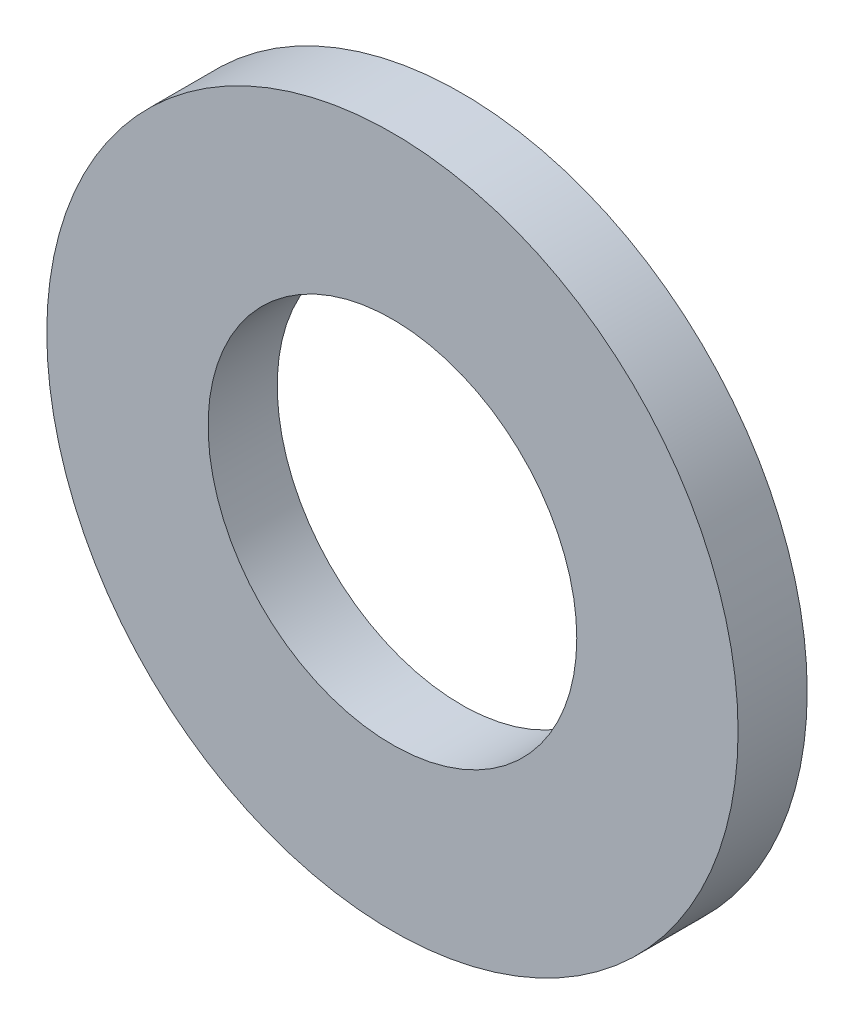
ISO-10303-21;
HEADER;
FILE_DESCRIPTION(('STEP AP214'),'2;1');
FILE_NAME('part.step','',(''),(''),'','','');
FILE_SCHEMA(('AUTOMOTIVE_DESIGN { 1 0 10303 214 1 1 1 1 }'));
ENDSEC;
DATA;
#1=APPLICATION_CONTEXT('core data for automotive mechanical design processes');
#2=APPLICATION_PROTOCOL_DEFINITION('international standard','automotive_design',2000,#1);
#3=PRODUCT_CONTEXT('',#1,'mechanical');
#4=PRODUCT('Part','Part','',(#3));
#5=PRODUCT_RELATED_PRODUCT_CATEGORY('part','',(#4));
#6=PRODUCT_DEFINITION_FORMATION('','',#4);
#7=PRODUCT_DEFINITION_CONTEXT('part definition',#1,'design');
#8=PRODUCT_DEFINITION('design','',#6,#7);
#9=PRODUCT_DEFINITION_SHAPE('','',#8);
#10=(LENGTH_UNIT() NAMED_UNIT(*) SI_UNIT(.MILLI.,.METRE.));
#11=(NAMED_UNIT(*) PLANE_ANGLE_UNIT() SI_UNIT($,.RADIAN.));
#12=(NAMED_UNIT(*) SI_UNIT($,.STERADIAN.) SOLID_ANGLE_UNIT());
#13=UNCERTAINTY_MEASURE_WITH_UNIT(LENGTH_MEASURE(1.E-05),#10,'distance_accuracy_value','');
#14=(GEOMETRIC_REPRESENTATION_CONTEXT(3) GLOBAL_UNCERTAINTY_ASSIGNED_CONTEXT((#13)) GLOBAL_UNIT_ASSIGNED_CONTEXT((#10,
#11,#12)) REPRESENTATION_CONTEXT('',''));
#15=CARTESIAN_POINT('',(0.,0.,0.));
#16=DIRECTION('',(0.,0.,1.));
#17=DIRECTION('',(1.,0.,0.));
#18=AXIS2_PLACEMENT_3D('',#15,#16,#17);
#19=CARTESIAN_POINT('',(0.,0.,0.6));
#20=DIRECTION('',(0.,0.,1.));
#21=DIRECTION('',(1.,0.,0.));
#22=AXIS2_PLACEMENT_3D('',#19,#20,#21);
#23=PLANE('',#22);
#24=CARTESIAN_POINT('',(0.,0.,0.6));
#25=DIRECTION('',(0.,0.,1.));
#26=DIRECTION('',(1.,0.,0.));
#27=AXIS2_PLACEMENT_3D('',#24,#25,#26);
#28=CIRCLE('',#27,3.);
#29=CARTESIAN_POINT('',(3.,0.,0.6));
#30=VERTEX_POINT('',#29);
#31=EDGE_CURVE('E10',#30,#30,#28,.T.);
#32=ORIENTED_EDGE('',*,*,#31,.T.);
#33=EDGE_LOOP('',(#32));
#34=FACE_BOUND('',#33,.T.);
#35=CARTESIAN_POINT('',(0.,0.,0.6));
#36=DIRECTION('',(0.,0.,1.));
#37=DIRECTION('',(1.,0.,0.));
#38=AXIS2_PLACEMENT_3D('',#35,#36,#37);
#39=CIRCLE('',#38,1.6);
#40=CARTESIAN_POINT('',(1.6,0.,0.6));
#41=VERTEX_POINT('',#40);
#42=EDGE_CURVE('E41',#41,#41,#39,.T.);
#43=ORIENTED_EDGE('',*,*,#42,.F.);
#44=EDGE_LOOP('',(#43));
#45=FACE_BOUND('',#44,.T.);
#46=ADVANCED_FACE('F30',(#34,#45),#23,.T.);
#47=CARTESIAN_POINT('',(0.,0.,0.));
#48=DIRECTION('',(0.,0.,1.));
#49=DIRECTION('',(1.,0.,0.));
#50=AXIS2_PLACEMENT_3D('',#47,#48,#49);
#51=PLANE('',#50);
#52=CARTESIAN_POINT('',(0.,0.,0.));
#53=DIRECTION('',(0.,0.,1.));
#54=DIRECTION('',(1.,0.,0.));
#55=AXIS2_PLACEMENT_3D('',#52,#53,#54);
#56=CIRCLE('',#55,3.);
#57=CARTESIAN_POINT('',(3.,0.,0.));
#58=VERTEX_POINT('',#57);
#59=EDGE_CURVE('E34',#58,#58,#56,.T.);
#60=ORIENTED_EDGE('',*,*,#59,.F.);
#61=EDGE_LOOP('',(#60));
#62=FACE_BOUND('',#61,.T.);
#63=CARTESIAN_POINT('',(0.,0.,0.));
#64=DIRECTION('',(0.,0.,1.));
#65=DIRECTION('',(1.,0.,0.));
#66=AXIS2_PLACEMENT_3D('',#63,#64,#65);
#67=CIRCLE('',#66,1.6);
#68=CARTESIAN_POINT('',(1.6,0.,0.));
#69=VERTEX_POINT('',#68);
#70=EDGE_CURVE('E43',#69,#69,#67,.T.);
#71=ORIENTED_EDGE('',*,*,#70,.T.);
#72=EDGE_LOOP('',(#71));
#73=FACE_BOUND('',#72,.T.);
#74=ADVANCED_FACE('F53',(#62,#73),#51,.F.);
#75=CARTESIAN_POINT('',(0.,0.,0.6));
#76=DIRECTION('',(0.,0.,-1.));
#77=DIRECTION('',(-1.,0.,0.));
#78=AXIS2_PLACEMENT_3D('',#75,#76,#77);
#79=CYLINDRICAL_SURFACE('',#78,3.);
#80=ORIENTED_EDGE('',*,*,#31,.F.);
#81=EDGE_LOOP('',(#80));
#82=FACE_BOUND('',#81,.T.);
#83=ORIENTED_EDGE('',*,*,#59,.T.);
#84=EDGE_LOOP('',(#83));
#85=FACE_BOUND('',#84,.T.);
#86=ADVANCED_FACE('F32',(#82,#85),#79,.T.);
#87=CARTESIAN_POINT('',(0.,0.,0.6));
#88=DIRECTION('',(0.,0.,-1.));
#89=DIRECTION('',(-1.,0.,0.));
#90=AXIS2_PLACEMENT_3D('',#87,#88,#89);
#91=CYLINDRICAL_SURFACE('',#90,1.6);
#92=ORIENTED_EDGE('',*,*,#42,.T.);
#93=EDGE_LOOP('',(#92));
#94=FACE_BOUND('',#93,.T.);
#95=ORIENTED_EDGE('',*,*,#70,.F.);
#96=EDGE_LOOP('',(#95));
#97=FACE_BOUND('',#96,.T.);
#98=ADVANCED_FACE('F49',(#94,#97),#91,.F.);
#99=CLOSED_SHELL('',(#46,#74,#86,#98));
#100=MANIFOLD_SOLID_BREP('B2',#99);
#101=ADVANCED_BREP_SHAPE_REPRESENTATION('',(#18,#100),#14);
#102=SHAPE_DEFINITION_REPRESENTATION(#9,#101);
ENDSEC;
END-ISO-10303-21;
